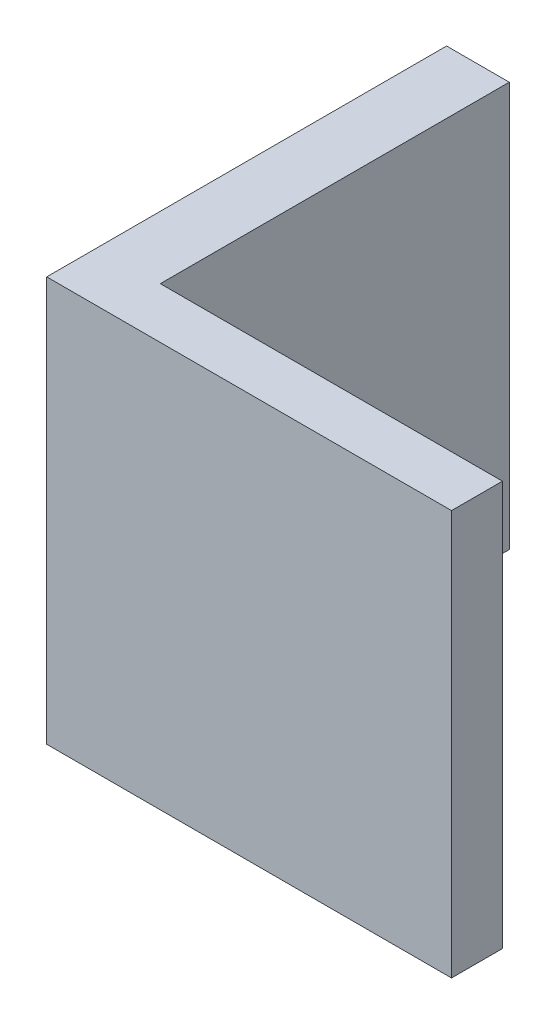
ISO-10303-21;
HEADER;
FILE_DESCRIPTION(('STEP AP214'),'2;1');
FILE_NAME('part.step','',(''),(''),'','','');
FILE_SCHEMA(('AUTOMOTIVE_DESIGN { 1 0 10303 214 1 1 1 1 }'));
ENDSEC;
DATA;
#1=APPLICATION_CONTEXT('core data for automotive mechanical design processes');
#2=APPLICATION_PROTOCOL_DEFINITION('international standard','automotive_design',2000,#1);
#3=PRODUCT_CONTEXT('',#1,'mechanical');
#4=PRODUCT('Part','Part','',(#3));
#5=PRODUCT_RELATED_PRODUCT_CATEGORY('part','',(#4));
#6=PRODUCT_DEFINITION_FORMATION('','',#4);
#7=PRODUCT_DEFINITION_CONTEXT('part definition',#1,'design');
#8=PRODUCT_DEFINITION('design','',#6,#7);
#9=PRODUCT_DEFINITION_SHAPE('','',#8);
#10=(LENGTH_UNIT() NAMED_UNIT(*) SI_UNIT(.MILLI.,.METRE.));
#11=(NAMED_UNIT(*) PLANE_ANGLE_UNIT() SI_UNIT($,.RADIAN.));
#12=(NAMED_UNIT(*) SI_UNIT($,.STERADIAN.) SOLID_ANGLE_UNIT());
#13=UNCERTAINTY_MEASURE_WITH_UNIT(LENGTH_MEASURE(1.E-05),#10,'distance_accuracy_value','');
#14=(GEOMETRIC_REPRESENTATION_CONTEXT(3) GLOBAL_UNCERTAINTY_ASSIGNED_CONTEXT((#13)) GLOBAL_UNIT_ASSIGNED_CONTEXT((#10,
#11,#12)) REPRESENTATION_CONTEXT('',''));
#15=CARTESIAN_POINT('',(0.,0.,0.));
#16=DIRECTION('',(0.,0.,1.));
#17=DIRECTION('',(1.,0.,0.));
#18=AXIS2_PLACEMENT_3D('',#15,#16,#17);
#19=CARTESIAN_POINT('',(-75.145232104087,10.16,-27.2579572347884));
#20=DIRECTION('',(1.,0.,0.));
#21=DIRECTION('',(0.,0.,-1.));
#22=AXIS2_PLACEMENT_3D('',#19,#20,#21);
#23=PLANE('',#22);
#24=DIRECTION('',(0.,0.,1.));
#25=VECTOR('',#24,1.);
#26=CARTESIAN_POINT('',(-75.145232104087,0.,-27.2579572347884));
#27=LINE('',#26,#25);
#28=CARTESIAN_POINT('',(-75.145232104087,0.,-27.2579572347884));
#29=VERTEX_POINT('',#28);
#30=CARTESIAN_POINT('',(-75.145232104087,0.,-17.2220729801617));
#31=VERTEX_POINT('',#30);
#32=EDGE_CURVE('E116',#29,#31,#27,.T.);
#33=ORIENTED_EDGE('',*,*,#32,.T.);
#34=DIRECTION('',(0.,-1.,0.));
#35=VECTOR('',#34,1.);
#36=CARTESIAN_POINT('',(-75.145232104087,10.16,-17.2220729801617));
#37=LINE('',#36,#35);
#38=CARTESIAN_POINT('',(-75.145232104087,10.16,-17.2220729801617));
#39=VERTEX_POINT('',#38);
#40=EDGE_CURVE('E11',#39,#31,#37,.T.);
#41=ORIENTED_EDGE('',*,*,#40,.F.);
#42=DIRECTION('',(0.,0.,1.));
#43=VECTOR('',#42,1.);
#44=CARTESIAN_POINT('',(-75.145232104087,10.16,-27.2579572347884));
#45=LINE('',#44,#43);
#46=CARTESIAN_POINT('',(-75.145232104087,10.16,-27.2579572347884));
#47=VERTEX_POINT('',#46);
#48=EDGE_CURVE('E118',#47,#39,#45,.T.);
#49=ORIENTED_EDGE('',*,*,#48,.F.);
#50=DIRECTION('',(0.,-1.,0.));
#51=VECTOR('',#50,1.);
#52=CARTESIAN_POINT('',(-75.145232104087,10.16,-27.2579572347884));
#53=LINE('',#52,#51);
#54=EDGE_CURVE('E125',#47,#29,#53,.T.);
#55=ORIENTED_EDGE('',*,*,#54,.T.);
#56=EDGE_LOOP('',(#33,#41,#49,#55));
#57=FACE_BOUND('',#56,.T.);
#58=ADVANCED_FACE('F32',(#57),#23,.F.);
#59=CARTESIAN_POINT('',(-75.145232104087,10.16,-17.2220729801617));
#60=DIRECTION('',(0.,0.,-1.));
#61=DIRECTION('',(-1.,0.,0.));
#62=AXIS2_PLACEMENT_3D('',#59,#60,#61);
#63=PLANE('',#62);
#64=DIRECTION('',(1.,0.,0.));
#65=VECTOR('',#64,1.);
#66=CARTESIAN_POINT('',(-75.145232104087,0.,-17.2220729801617));
#67=LINE('',#66,#65);
#68=CARTESIAN_POINT('',(-64.9854480438477,0.,-17.2220729801617));
#69=VERTEX_POINT('',#68);
#70=EDGE_CURVE('E128',#31,#69,#67,.T.);
#71=ORIENTED_EDGE('',*,*,#70,.T.);
#72=DIRECTION('',(0.,-1.,0.));
#73=VECTOR('',#72,1.);
#74=CARTESIAN_POINT('',(-64.9854480438477,10.16,-17.2220729801617));
#75=LINE('',#74,#73);
#76=CARTESIAN_POINT('',(-64.9854480438477,10.16,-17.2220729801617));
#77=VERTEX_POINT('',#76);
#78=EDGE_CURVE('E39',#77,#69,#75,.T.);
#79=ORIENTED_EDGE('',*,*,#78,.F.);
#80=DIRECTION('',(1.,0.,0.));
#81=VECTOR('',#80,1.);
#82=CARTESIAN_POINT('',(-75.145232104087,10.16,-17.2220729801617));
#83=LINE('',#82,#81);
#84=EDGE_CURVE('E78',#39,#77,#83,.T.);
#85=ORIENTED_EDGE('',*,*,#84,.F.);
#86=ORIENTED_EDGE('',*,*,#40,.T.);
#87=EDGE_LOOP('',(#71,#79,#85,#86));
#88=FACE_BOUND('',#87,.T.);
#89=ADVANCED_FACE('F138',(#88),#63,.F.);
#90=CARTESIAN_POINT('',(-64.9854480438477,10.16,-27.2579572347884));
#91=DIRECTION('',(-1.,0.,0.));
#92=DIRECTION('',(0.,0.,1.));
#93=AXIS2_PLACEMENT_3D('',#90,#91,#92);
#94=PLANE('',#93);
#95=DIRECTION('',(0.,0.,-1.));
#96=VECTOR('',#95,1.);
#97=CARTESIAN_POINT('',(-64.9854480438477,0.,-27.2579572347884));
#98=LINE('',#97,#96);
#99=CARTESIAN_POINT('',(-64.9854480438477,0.,-18.4997296573472));
#100=VERTEX_POINT('',#99);
#101=EDGE_CURVE('E130',#69,#100,#98,.T.);
#102=ORIENTED_EDGE('',*,*,#101,.T.);
#103=DIRECTION('',(0.,1.,0.));
#104=VECTOR('',#103,1.);
#105=CARTESIAN_POINT('',(-64.9854480438477,0.,-18.4997296573472));
#106=LINE('',#105,#104);
#107=CARTESIAN_POINT('',(-64.9854480438477,10.16,-18.4997296573472));
#108=VERTEX_POINT('',#107);
#109=EDGE_CURVE('E46',#100,#108,#106,.T.);
#110=ORIENTED_EDGE('',*,*,#109,.T.);
#111=DIRECTION('',(0.,0.,-1.));
#112=VECTOR('',#111,1.);
#113=CARTESIAN_POINT('',(-64.9854480438477,10.16,-27.2579572347884));
#114=LINE('',#113,#112);
#115=EDGE_CURVE('E121',#77,#108,#114,.T.);
#116=ORIENTED_EDGE('',*,*,#115,.F.);
#117=ORIENTED_EDGE('',*,*,#78,.T.);
#118=EDGE_LOOP('',(#102,#110,#116,#117));
#119=FACE_BOUND('',#118,.T.);
#120=ADVANCED_FACE('F136',(#119),#94,.F.);
#121=CARTESIAN_POINT('',(-75.145232104087,10.16,-27.2579572347884));
#122=DIRECTION('',(0.,0.,1.));
#123=DIRECTION('',(1.,0.,0.));
#124=AXIS2_PLACEMENT_3D('',#121,#122,#123);
#125=PLANE('',#124);
#126=DIRECTION('',(-1.,0.,0.));
#127=VECTOR('',#126,1.);
#128=CARTESIAN_POINT('',(-75.145232104087,10.16,-27.2579572347884));
#129=LINE('',#128,#127);
#130=CARTESIAN_POINT('',(-73.5718309079072,10.16,-27.2579572347884));
#131=VERTEX_POINT('',#130);
#132=EDGE_CURVE('E55',#131,#47,#129,.T.);
#133=ORIENTED_EDGE('',*,*,#132,.F.);
#134=DIRECTION('',(0.,1.,0.));
#135=VECTOR('',#134,1.);
#136=CARTESIAN_POINT('',(-73.5718309079072,0.,-27.2579572347884));
#137=LINE('',#136,#135);
#138=CARTESIAN_POINT('',(-73.5718309079072,0.,-27.2579572347884));
#139=VERTEX_POINT('',#138);
#140=EDGE_CURVE('E114',#139,#131,#137,.T.);
#141=ORIENTED_EDGE('',*,*,#140,.F.);
#142=DIRECTION('',(-1.,0.,0.));
#143=VECTOR('',#142,1.);
#144=CARTESIAN_POINT('',(-75.145232104087,0.,-27.2579572347884));
#145=LINE('',#144,#143);
#146=EDGE_CURVE('E73',#139,#29,#145,.T.);
#147=ORIENTED_EDGE('',*,*,#146,.T.);
#148=ORIENTED_EDGE('',*,*,#54,.F.);
#149=EDGE_LOOP('',(#133,#141,#147,#148));
#150=FACE_BOUND('',#149,.T.);
#151=ADVANCED_FACE('F141',(#150),#125,.F.);
#152=CARTESIAN_POINT('',(0.,10.16,0.));
#153=DIRECTION('',(0.,1.,0.));
#154=DIRECTION('',(0.,0.,1.));
#155=AXIS2_PLACEMENT_3D('',#152,#153,#154);
#156=PLANE('',#155);
#157=DIRECTION('',(0.,0.,1.));
#158=VECTOR('',#157,1.);
#159=CARTESIAN_POINT('',(-73.5718309079072,10.16,-27.2579572347884));
#160=LINE('',#159,#158);
#161=CARTESIAN_POINT('',(-73.5718309079072,10.16,-18.4997296573472));
#162=VERTEX_POINT('',#161);
#163=EDGE_CURVE('E98',#131,#162,#160,.T.);
#164=ORIENTED_EDGE('',*,*,#163,.F.);
#165=ORIENTED_EDGE('',*,*,#132,.T.);
#166=ORIENTED_EDGE('',*,*,#48,.T.);
#167=ORIENTED_EDGE('',*,*,#84,.T.);
#168=ORIENTED_EDGE('',*,*,#115,.T.);
#169=DIRECTION('',(1.,0.,0.));
#170=VECTOR('',#169,1.);
#171=CARTESIAN_POINT('',(-73.5718309079072,10.16,-18.4997296573472));
#172=LINE('',#171,#170);
#173=EDGE_CURVE('E109',#162,#108,#172,.T.);
#174=ORIENTED_EDGE('',*,*,#173,.F.);
#175=EDGE_LOOP('',(#164,#165,#166,#167,#168,#174));
#176=FACE_BOUND('',#175,.T.);
#177=ADVANCED_FACE('F142',(#176),#156,.T.);
#178=CARTESIAN_POINT('',(0.,0.,0.));
#179=DIRECTION('',(0.,1.,0.));
#180=DIRECTION('',(0.,0.,1.));
#181=AXIS2_PLACEMENT_3D('',#178,#179,#180);
#182=PLANE('',#181);
#183=ORIENTED_EDGE('',*,*,#146,.F.);
#184=DIRECTION('',(0.,0.,1.));
#185=VECTOR('',#184,1.);
#186=CARTESIAN_POINT('',(-73.5718309079072,0.,-27.2579572347884));
#187=LINE('',#186,#185);
#188=CARTESIAN_POINT('',(-73.5718309079072,0.,-18.4997296573472));
#189=VERTEX_POINT('',#188);
#190=EDGE_CURVE('E97',#139,#189,#187,.T.);
#191=ORIENTED_EDGE('',*,*,#190,.T.);
#192=DIRECTION('',(1.,0.,0.));
#193=VECTOR('',#192,1.);
#194=CARTESIAN_POINT('',(-73.5718309079072,0.,-18.4997296573472));
#195=LINE('',#194,#193);
#196=EDGE_CURVE('E100',#189,#100,#195,.T.);
#197=ORIENTED_EDGE('',*,*,#196,.T.);
#198=ORIENTED_EDGE('',*,*,#101,.F.);
#199=ORIENTED_EDGE('',*,*,#70,.F.);
#200=ORIENTED_EDGE('',*,*,#32,.F.);
#201=EDGE_LOOP('',(#183,#191,#197,#198,#199,#200));
#202=FACE_BOUND('',#201,.T.);
#203=ADVANCED_FACE('F107',(#202),#182,.F.);
#204=CARTESIAN_POINT('',(-73.5718309079072,0.,-27.2579572347884));
#205=DIRECTION('',(-1.,0.,0.));
#206=DIRECTION('',(0.,0.,1.));
#207=AXIS2_PLACEMENT_3D('',#204,#205,#206);
#208=PLANE('',#207);
#209=ORIENTED_EDGE('',*,*,#163,.T.);
#210=DIRECTION('',(0.,1.,0.));
#211=VECTOR('',#210,1.);
#212=CARTESIAN_POINT('',(-73.5718309079072,0.,-18.4997296573472));
#213=LINE('',#212,#211);
#214=EDGE_CURVE('E94',#189,#162,#213,.T.);
#215=ORIENTED_EDGE('',*,*,#214,.F.);
#216=ORIENTED_EDGE('',*,*,#190,.F.);
#217=ORIENTED_EDGE('',*,*,#140,.T.);
#218=EDGE_LOOP('',(#209,#215,#216,#217));
#219=FACE_BOUND('',#218,.T.);
#220=ADVANCED_FACE('F95',(#219),#208,.F.);
#221=CARTESIAN_POINT('',(-73.5718309079072,0.,-18.4997296573472));
#222=DIRECTION('',(0.,0.,1.));
#223=DIRECTION('',(1.,0.,0.));
#224=AXIS2_PLACEMENT_3D('',#221,#222,#223);
#225=PLANE('',#224);
#226=ORIENTED_EDGE('',*,*,#173,.T.);
#227=ORIENTED_EDGE('',*,*,#109,.F.);
#228=ORIENTED_EDGE('',*,*,#196,.F.);
#229=ORIENTED_EDGE('',*,*,#214,.T.);
#230=EDGE_LOOP('',(#226,#227,#228,#229));
#231=FACE_BOUND('',#230,.T.);
#232=ADVANCED_FACE('F102',(#231),#225,.F.);
#233=CLOSED_SHELL('',(#58,#89,#120,#151,#177,#203,#220,#232));
#234=MANIFOLD_SOLID_BREP('B2',#233);
#235=ADVANCED_BREP_SHAPE_REPRESENTATION('',(#18,#234),#14);
#236=SHAPE_DEFINITION_REPRESENTATION(#9,#235);
ENDSEC;
END-ISO-10303-21;
